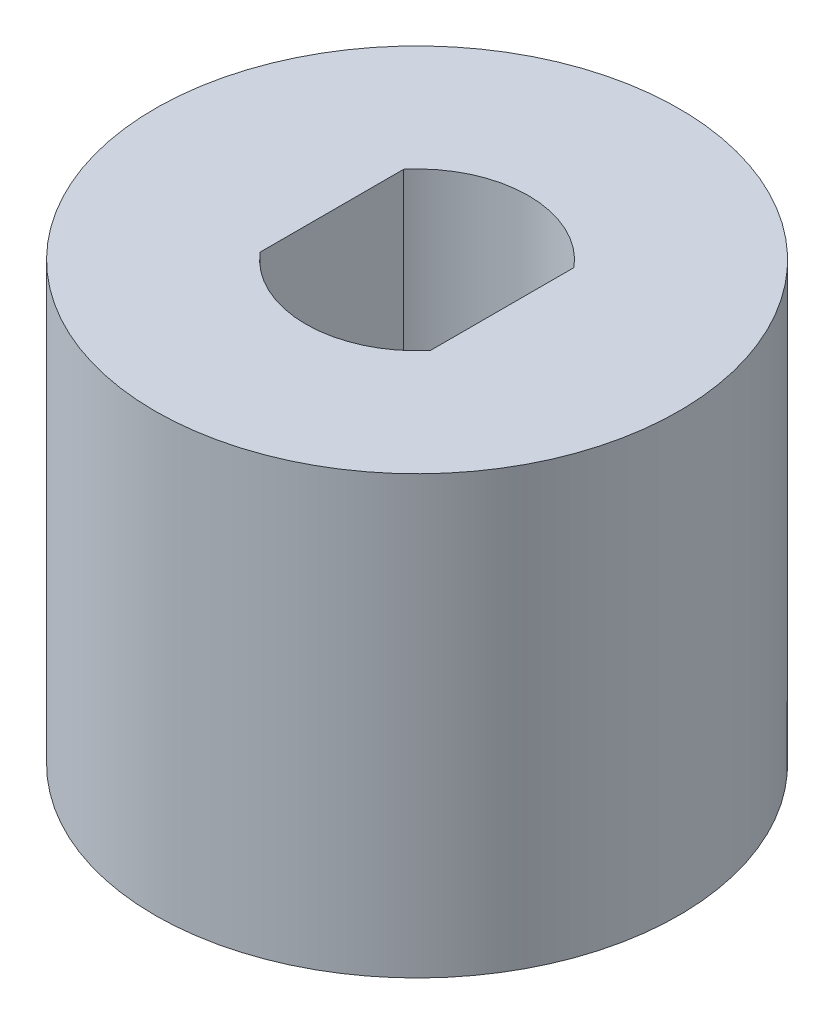
ISO-10303-21;
HEADER;
FILE_DESCRIPTION(('STEP AP214'),'2;1');
FILE_NAME('part.step','',(''),(''),'','','');
FILE_SCHEMA(('AUTOMOTIVE_DESIGN { 1 0 10303 214 1 1 1 1 }'));
ENDSEC;
DATA;
#1=APPLICATION_CONTEXT('core data for automotive mechanical design processes');
#2=APPLICATION_PROTOCOL_DEFINITION('international standard','automotive_design',2000,#1);
#3=PRODUCT_CONTEXT('',#1,'mechanical');
#4=PRODUCT('Part','Part','',(#3));
#5=PRODUCT_RELATED_PRODUCT_CATEGORY('part','',(#4));
#6=PRODUCT_DEFINITION_FORMATION('','',#4);
#7=PRODUCT_DEFINITION_CONTEXT('part definition',#1,'design');
#8=PRODUCT_DEFINITION('design','',#6,#7);
#9=PRODUCT_DEFINITION_SHAPE('','',#8);
#10=(LENGTH_UNIT() NAMED_UNIT(*) SI_UNIT(.MILLI.,.METRE.));
#11=(NAMED_UNIT(*) PLANE_ANGLE_UNIT() SI_UNIT($,.RADIAN.));
#12=(NAMED_UNIT(*) SI_UNIT($,.STERADIAN.) SOLID_ANGLE_UNIT());
#13=UNCERTAINTY_MEASURE_WITH_UNIT(LENGTH_MEASURE(1.E-05),#10,'distance_accuracy_value','');
#14=(GEOMETRIC_REPRESENTATION_CONTEXT(3) GLOBAL_UNCERTAINTY_ASSIGNED_CONTEXT((#13)) GLOBAL_UNIT_ASSIGNED_CONTEXT((#10,
#11,#12)) REPRESENTATION_CONTEXT('',''));
#15=CARTESIAN_POINT('',(0.,0.,0.));
#16=DIRECTION('',(0.,0.,1.));
#17=DIRECTION('',(1.,0.,0.));
#18=AXIS2_PLACEMENT_3D('',#15,#16,#17);
#19=CARTESIAN_POINT('',(0.,10.,0.));
#20=DIRECTION('',(0.,-1.,0.));
#21=DIRECTION('',(0.,0.,-1.));
#22=AXIS2_PLACEMENT_3D('',#19,#20,#21);
#23=CYLINDRICAL_SURFACE('',#22,6.);
#24=CARTESIAN_POINT('',(0.,10.,0.));
#25=DIRECTION('',(0.,1.,0.));
#26=DIRECTION('',(0.,0.,1.));
#27=AXIS2_PLACEMENT_3D('',#24,#25,#26);
#28=CIRCLE('',#27,6.);
#29=CARTESIAN_POINT('',(0.,10.,6.));
#30=VERTEX_POINT('',#29);
#31=EDGE_CURVE('E161',#30,#30,#28,.T.);
#32=ORIENTED_EDGE('',*,*,#31,.F.);
#33=EDGE_LOOP('',(#32));
#34=FACE_BOUND('',#33,.T.);
#35=CARTESIAN_POINT('',(0.,0.,0.));
#36=DIRECTION('',(0.,1.,0.));
#37=DIRECTION('',(0.,0.,1.));
#38=AXIS2_PLACEMENT_3D('',#35,#36,#37);
#39=CIRCLE('',#38,6.);
#40=CARTESIAN_POINT('',(0.,0.,6.));
#41=VERTEX_POINT('',#40);
#42=EDGE_CURVE('E154',#41,#41,#39,.T.);
#43=ORIENTED_EDGE('',*,*,#42,.T.);
#44=EDGE_LOOP('',(#43));
#45=FACE_BOUND('',#44,.T.);
#46=ADVANCED_FACE('F37',(#34,#45),#23,.T.);
#47=CARTESIAN_POINT('',(0.,10.,0.));
#48=DIRECTION('',(0.,1.,0.));
#49=DIRECTION('',(0.,0.,1.));
#50=AXIS2_PLACEMENT_3D('',#47,#48,#49);
#51=PLANE('',#50);
#52=CARTESIAN_POINT('',(0.,10.,0.));
#53=DIRECTION('',(0.,1.,0.));
#54=DIRECTION('',(0.,0.,1.));
#55=AXIS2_PLACEMENT_3D('',#52,#53,#54);
#56=CIRCLE('',#55,2.55);
#57=CARTESIAN_POINT('',(-1.95,10.,1.6431676725155));
#58=VERTEX_POINT('',#57);
#59=CARTESIAN_POINT('',(1.95,10.,1.6431676725155));
#60=VERTEX_POINT('',#59);
#61=EDGE_CURVE('E51',#58,#60,#56,.T.);
#62=ORIENTED_EDGE('',*,*,#61,.F.);
#63=DIRECTION('',(0.,0.,1.));
#64=VECTOR('',#63,1.);
#65=CARTESIAN_POINT('',(-1.95,10.,1.6431676725155));
#66=LINE('',#65,#64);
#67=CARTESIAN_POINT('',(-1.95,10.,-1.6431676725155));
#68=VERTEX_POINT('',#67);
#69=EDGE_CURVE('E119',#68,#58,#66,.T.);
#70=ORIENTED_EDGE('',*,*,#69,.F.);
#71=CARTESIAN_POINT('',(0.,10.,0.));
#72=DIRECTION('',(0.,1.,0.));
#73=DIRECTION('',(0.,0.,1.));
#74=AXIS2_PLACEMENT_3D('',#71,#72,#73);
#75=CIRCLE('',#74,2.55);
#76=CARTESIAN_POINT('',(1.95,10.,-1.6431676725155));
#77=VERTEX_POINT('',#76);
#78=EDGE_CURVE('E103',#77,#68,#75,.T.);
#79=ORIENTED_EDGE('',*,*,#78,.F.);
#80=DIRECTION('',(0.,0.,-1.));
#81=VECTOR('',#80,1.);
#82=CARTESIAN_POINT('',(1.95,10.,1.6431676725155));
#83=LINE('',#82,#81);
#84=EDGE_CURVE('E112',#60,#77,#83,.T.);
#85=ORIENTED_EDGE('',*,*,#84,.F.);
#86=EDGE_LOOP('',(#62,#70,#79,#85));
#87=FACE_BOUND('',#86,.T.);
#88=ORIENTED_EDGE('',*,*,#31,.T.);
#89=EDGE_LOOP('',(#88));
#90=FACE_BOUND('',#89,.T.);
#91=ADVANCED_FACE('F116',(#87,#90),#51,.T.);
#92=CARTESIAN_POINT('',(0.,0.,0.));
#93=DIRECTION('',(0.,1.,0.));
#94=DIRECTION('',(0.,0.,1.));
#95=AXIS2_PLACEMENT_3D('',#92,#93,#94);
#96=PLANE('',#95);
#97=DIRECTION('',(0.,0.,1.));
#98=VECTOR('',#97,1.);
#99=CARTESIAN_POINT('',(2.5,0.,-2.48508048159411));
#100=LINE('',#99,#98);
#101=CARTESIAN_POINT('',(2.5,0.,-2.48508048159411));
#102=VERTEX_POINT('',#101);
#103=CARTESIAN_POINT('',(2.5,0.,2.48508048159411));
#104=VERTEX_POINT('',#103);
#105=EDGE_CURVE('E144',#102,#104,#100,.T.);
#106=ORIENTED_EDGE('',*,*,#105,.F.);
#107=CARTESIAN_POINT('',(0.,0.,0.));
#108=DIRECTION('',(0.,-1.,0.));
#109=DIRECTION('',(0.,0.,-1.));
#110=AXIS2_PLACEMENT_3D('',#107,#108,#109);
#111=CIRCLE('',#110,3.525);
#112=CARTESIAN_POINT('',(-2.5,0.,-2.48508048159411));
#113=VERTEX_POINT('',#112);
#114=EDGE_CURVE('E126',#113,#102,#111,.T.);
#115=ORIENTED_EDGE('',*,*,#114,.F.);
#116=DIRECTION('',(0.,0.,-1.));
#117=VECTOR('',#116,1.);
#118=CARTESIAN_POINT('',(-2.5,0.,-2.48508048159411));
#119=LINE('',#118,#117);
#120=CARTESIAN_POINT('',(-2.5,0.,2.48508048159411));
#121=VERTEX_POINT('',#120);
#122=EDGE_CURVE('E133',#121,#113,#119,.T.);
#123=ORIENTED_EDGE('',*,*,#122,.F.);
#124=CARTESIAN_POINT('',(0.,0.,0.));
#125=DIRECTION('',(0.,-1.,0.));
#126=DIRECTION('',(0.,0.,-1.));
#127=AXIS2_PLACEMENT_3D('',#124,#125,#126);
#128=CIRCLE('',#127,3.525);
#129=EDGE_CURVE('E147',#104,#121,#128,.T.);
#130=ORIENTED_EDGE('',*,*,#129,.F.);
#131=EDGE_LOOP('',(#106,#115,#123,#130));
#132=FACE_BOUND('',#131,.T.);
#133=ORIENTED_EDGE('',*,*,#42,.F.);
#134=EDGE_LOOP('',(#133));
#135=FACE_BOUND('',#134,.T.);
#136=ADVANCED_FACE('F192',(#132,#135),#96,.F.);
#137=CARTESIAN_POINT('',(0.,6.,0.));
#138=DIRECTION('',(0.,-1.,0.));
#139=DIRECTION('',(0.,0.,-1.));
#140=AXIS2_PLACEMENT_3D('',#137,#138,#139);
#141=CYLINDRICAL_SURFACE('',#140,3.525);
#142=ORIENTED_EDGE('',*,*,#114,.T.);
#143=DIRECTION('',(0.,-1.,0.));
#144=VECTOR('',#143,1.);
#145=CARTESIAN_POINT('',(2.5,6.,-2.48508048159411));
#146=LINE('',#145,#144);
#147=CARTESIAN_POINT('',(2.5,6.,-2.48508048159411));
#148=VERTEX_POINT('',#147);
#149=EDGE_CURVE('E142',#148,#102,#146,.T.);
#150=ORIENTED_EDGE('',*,*,#149,.F.);
#151=CARTESIAN_POINT('',(0.,6.,0.));
#152=DIRECTION('',(0.,-1.,0.));
#153=DIRECTION('',(0.,0.,-1.));
#154=AXIS2_PLACEMENT_3D('',#151,#152,#153);
#155=CIRCLE('',#154,3.525);
#156=CARTESIAN_POINT('',(-2.5,6.,-2.48508048159411));
#157=VERTEX_POINT('',#156);
#158=EDGE_CURVE('E129',#157,#148,#155,.T.);
#159=ORIENTED_EDGE('',*,*,#158,.F.);
#160=DIRECTION('',(0.,-1.,0.));
#161=VECTOR('',#160,1.);
#162=CARTESIAN_POINT('',(-2.5,6.,-2.48508048159411));
#163=LINE('',#162,#161);
#164=EDGE_CURVE('E152',#157,#113,#163,.T.);
#165=ORIENTED_EDGE('',*,*,#164,.T.);
#166=EDGE_LOOP('',(#142,#150,#159,#165));
#167=FACE_BOUND('',#166,.T.);
#168=ADVANCED_FACE('F199',(#167),#141,.F.);
#169=CARTESIAN_POINT('',(-2.5,6.,-2.48508048159411));
#170=DIRECTION('',(-1.,0.,0.));
#171=DIRECTION('',(0.,0.,1.));
#172=AXIS2_PLACEMENT_3D('',#169,#170,#171);
#173=PLANE('',#172);
#174=ORIENTED_EDGE('',*,*,#122,.T.);
#175=ORIENTED_EDGE('',*,*,#164,.F.);
#176=DIRECTION('',(0.,0.,-1.));
#177=VECTOR('',#176,1.);
#178=CARTESIAN_POINT('',(-2.5,6.,-2.48508048159411));
#179=LINE('',#178,#177);
#180=CARTESIAN_POINT('',(-2.5,6.,2.48508048159411));
#181=VERTEX_POINT('',#180);
#182=EDGE_CURVE('E139',#181,#157,#179,.T.);
#183=ORIENTED_EDGE('',*,*,#182,.F.);
#184=DIRECTION('',(0.,-1.,0.));
#185=VECTOR('',#184,1.);
#186=CARTESIAN_POINT('',(-2.5,6.,2.48508048159411));
#187=LINE('',#186,#185);
#188=EDGE_CURVE('E155',#181,#121,#187,.T.);
#189=ORIENTED_EDGE('',*,*,#188,.T.);
#190=EDGE_LOOP('',(#174,#175,#183,#189));
#191=FACE_BOUND('',#190,.T.);
#192=ADVANCED_FACE('F204',(#191),#173,.F.);
#193=CARTESIAN_POINT('',(0.,6.,0.));
#194=DIRECTION('',(0.,-1.,0.));
#195=DIRECTION('',(0.,0.,-1.));
#196=AXIS2_PLACEMENT_3D('',#193,#194,#195);
#197=CYLINDRICAL_SURFACE('',#196,3.525);
#198=ORIENTED_EDGE('',*,*,#129,.T.);
#199=ORIENTED_EDGE('',*,*,#188,.F.);
#200=CARTESIAN_POINT('',(0.,6.,0.));
#201=DIRECTION('',(0.,-1.,0.));
#202=DIRECTION('',(0.,0.,-1.));
#203=AXIS2_PLACEMENT_3D('',#200,#201,#202);
#204=CIRCLE('',#203,3.525);
#205=CARTESIAN_POINT('',(2.5,6.,2.48508048159411));
#206=VERTEX_POINT('',#205);
#207=EDGE_CURVE('E136',#206,#181,#204,.T.);
#208=ORIENTED_EDGE('',*,*,#207,.F.);
#209=DIRECTION('',(0.,-1.,0.));
#210=VECTOR('',#209,1.);
#211=CARTESIAN_POINT('',(2.5,6.,2.48508048159411));
#212=LINE('',#211,#210);
#213=EDGE_CURVE('E157',#206,#104,#212,.T.);
#214=ORIENTED_EDGE('',*,*,#213,.T.);
#215=EDGE_LOOP('',(#198,#199,#208,#214));
#216=FACE_BOUND('',#215,.T.);
#217=ADVANCED_FACE('F211',(#216),#197,.F.);
#218=CARTESIAN_POINT('',(2.5,6.,-2.48508048159411));
#219=DIRECTION('',(1.,0.,0.));
#220=DIRECTION('',(0.,0.,-1.));
#221=AXIS2_PLACEMENT_3D('',#218,#219,#220);
#222=PLANE('',#221);
#223=ORIENTED_EDGE('',*,*,#105,.T.);
#224=ORIENTED_EDGE('',*,*,#213,.F.);
#225=DIRECTION('',(0.,0.,1.));
#226=VECTOR('',#225,1.);
#227=CARTESIAN_POINT('',(2.5,6.,-2.48508048159411));
#228=LINE('',#227,#226);
#229=EDGE_CURVE('E132',#148,#206,#228,.T.);
#230=ORIENTED_EDGE('',*,*,#229,.F.);
#231=ORIENTED_EDGE('',*,*,#149,.T.);
#232=EDGE_LOOP('',(#223,#224,#230,#231));
#233=FACE_BOUND('',#232,.T.);
#234=ADVANCED_FACE('F184',(#233),#222,.F.);
#235=CARTESIAN_POINT('',(0.,6.,0.));
#236=DIRECTION('',(0.,-1.,0.));
#237=DIRECTION('',(0.,0.,-1.));
#238=AXIS2_PLACEMENT_3D('',#235,#236,#237);
#239=PLANE('',#238);
#240=CARTESIAN_POINT('',(0.,6.,0.));
#241=DIRECTION('',(0.,-1.,0.));
#242=DIRECTION('',(0.,0.,-1.));
#243=AXIS2_PLACEMENT_3D('',#240,#241,#242);
#244=CIRCLE('',#243,2.55);
#245=CARTESIAN_POINT('',(1.95,6.,1.6431676725155));
#246=VERTEX_POINT('',#245);
#247=CARTESIAN_POINT('',(-1.95,6.,1.6431676725155));
#248=VERTEX_POINT('',#247);
#249=EDGE_CURVE('E11',#246,#248,#244,.T.);
#250=ORIENTED_EDGE('',*,*,#249,.F.);
#251=DIRECTION('',(0.,0.,1.));
#252=VECTOR('',#251,1.);
#253=CARTESIAN_POINT('',(1.95,6.,0.));
#254=LINE('',#253,#252);
#255=CARTESIAN_POINT('',(1.95,6.,-1.6431676725155));
#256=VERTEX_POINT('',#255);
#257=EDGE_CURVE('E164',#256,#246,#254,.T.);
#258=ORIENTED_EDGE('',*,*,#257,.F.);
#259=CARTESIAN_POINT('',(0.,6.,0.));
#260=DIRECTION('',(0.,-1.,0.));
#261=DIRECTION('',(0.,0.,-1.));
#262=AXIS2_PLACEMENT_3D('',#259,#260,#261);
#263=CIRCLE('',#262,2.55);
#264=CARTESIAN_POINT('',(-1.95,6.,-1.6431676725155));
#265=VERTEX_POINT('',#264);
#266=EDGE_CURVE('E106',#265,#256,#263,.T.);
#267=ORIENTED_EDGE('',*,*,#266,.F.);
#268=DIRECTION('',(0.,0.,-1.));
#269=VECTOR('',#268,1.);
#270=CARTESIAN_POINT('',(-1.95,6.,0.));
#271=LINE('',#270,#269);
#272=EDGE_CURVE('E44',#248,#265,#271,.T.);
#273=ORIENTED_EDGE('',*,*,#272,.F.);
#274=EDGE_LOOP('',(#250,#258,#267,#273));
#275=FACE_BOUND('',#274,.T.);
#276=ORIENTED_EDGE('',*,*,#158,.T.);
#277=ORIENTED_EDGE('',*,*,#229,.T.);
#278=ORIENTED_EDGE('',*,*,#207,.T.);
#279=ORIENTED_EDGE('',*,*,#182,.T.);
#280=EDGE_LOOP('',(#276,#277,#278,#279));
#281=FACE_BOUND('',#280,.T.);
#282=ADVANCED_FACE('F174',(#275,#281),#239,.T.);
#283=CARTESIAN_POINT('',(0.,5.,0.));
#284=DIRECTION('',(0.,1.,0.));
#285=DIRECTION('',(0.,0.,1.));
#286=AXIS2_PLACEMENT_3D('',#283,#284,#285);
#287=CYLINDRICAL_SURFACE('',#286,2.55);
#288=ORIENTED_EDGE('',*,*,#249,.T.);
#289=DIRECTION('',(0.,1.,0.));
#290=VECTOR('',#289,1.);
#291=CARTESIAN_POINT('',(-1.95,5.,1.6431676725155));
#292=LINE('',#291,#290);
#293=EDGE_CURVE('E124',#248,#58,#292,.T.);
#294=ORIENTED_EDGE('',*,*,#293,.T.);
#295=ORIENTED_EDGE('',*,*,#61,.T.);
#296=DIRECTION('',(0.,1.,0.));
#297=VECTOR('',#296,1.);
#298=CARTESIAN_POINT('',(1.95,5.,1.6431676725155));
#299=LINE('',#298,#297);
#300=EDGE_CURVE('E109',#246,#60,#299,.T.);
#301=ORIENTED_EDGE('',*,*,#300,.F.);
#302=EDGE_LOOP('',(#288,#294,#295,#301));
#303=FACE_BOUND('',#302,.T.);
#304=ADVANCED_FACE('F176',(#303),#287,.F.);
#305=CARTESIAN_POINT('',(-1.95,5.,1.6431676725155));
#306=DIRECTION('',(-1.,0.,0.));
#307=DIRECTION('',(0.,0.,1.));
#308=AXIS2_PLACEMENT_3D('',#305,#306,#307);
#309=PLANE('',#308);
#310=ORIENTED_EDGE('',*,*,#272,.T.);
#311=DIRECTION('',(0.,1.,0.));
#312=VECTOR('',#311,1.);
#313=CARTESIAN_POINT('',(-1.95,5.,-1.6431676725155));
#314=LINE('',#313,#312);
#315=EDGE_CURVE('E108',#265,#68,#314,.T.);
#316=ORIENTED_EDGE('',*,*,#315,.T.);
#317=ORIENTED_EDGE('',*,*,#69,.T.);
#318=ORIENTED_EDGE('',*,*,#293,.F.);
#319=EDGE_LOOP('',(#310,#316,#317,#318));
#320=FACE_BOUND('',#319,.T.);
#321=ADVANCED_FACE('F171',(#320),#309,.F.);
#322=CARTESIAN_POINT('',(0.,5.,0.));
#323=DIRECTION('',(0.,1.,0.));
#324=DIRECTION('',(0.,0.,1.));
#325=AXIS2_PLACEMENT_3D('',#322,#323,#324);
#326=CYLINDRICAL_SURFACE('',#325,2.55);
#327=ORIENTED_EDGE('',*,*,#266,.T.);
#328=DIRECTION('',(0.,1.,0.));
#329=VECTOR('',#328,1.);
#330=CARTESIAN_POINT('',(1.95,5.,-1.6431676725155));
#331=LINE('',#330,#329);
#332=EDGE_CURVE('E59',#256,#77,#331,.T.);
#333=ORIENTED_EDGE('',*,*,#332,.T.);
#334=ORIENTED_EDGE('',*,*,#78,.T.);
#335=ORIENTED_EDGE('',*,*,#315,.F.);
#336=EDGE_LOOP('',(#327,#333,#334,#335));
#337=FACE_BOUND('',#336,.T.);
#338=ADVANCED_FACE('F100',(#337),#326,.F.);
#339=CARTESIAN_POINT('',(1.95,5.,1.6431676725155));
#340=DIRECTION('',(1.,0.,0.));
#341=DIRECTION('',(0.,0.,-1.));
#342=AXIS2_PLACEMENT_3D('',#339,#340,#341);
#343=PLANE('',#342);
#344=ORIENTED_EDGE('',*,*,#257,.T.);
#345=ORIENTED_EDGE('',*,*,#300,.T.);
#346=ORIENTED_EDGE('',*,*,#84,.T.);
#347=ORIENTED_EDGE('',*,*,#332,.F.);
#348=EDGE_LOOP('',(#344,#345,#346,#347));
#349=FACE_BOUND('',#348,.T.);
#350=ADVANCED_FACE('F113',(#349),#343,.F.);
#351=CLOSED_SHELL('',(#46,#91,#136,#168,#192,#217,#234,#282,#304,#321,#338,#350));
#352=MANIFOLD_SOLID_BREP('B2',#351);
#353=ADVANCED_BREP_SHAPE_REPRESENTATION('',(#18,#352),#14);
#354=SHAPE_DEFINITION_REPRESENTATION(#9,#353);
ENDSEC;
END-ISO-10303-21;
